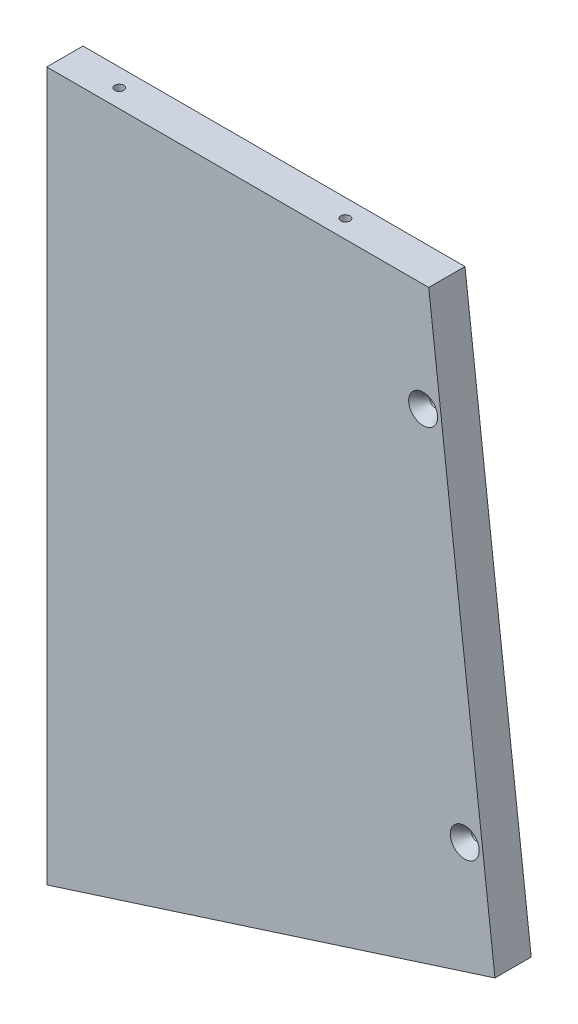
ISO-10303-21;
HEADER;
FILE_DESCRIPTION(('STEP AP214'),'2;1');
FILE_NAME('part.step','',(''),(''),'','','');
FILE_SCHEMA(('AUTOMOTIVE_DESIGN { 1 0 10303 214 1 1 1 1 }'));
ENDSEC;
DATA;
#1=APPLICATION_CONTEXT('core data for automotive mechanical design processes');
#2=APPLICATION_PROTOCOL_DEFINITION('international standard','automotive_design',2000,#1);
#3=PRODUCT_CONTEXT('',#1,'mechanical');
#4=PRODUCT('Part','Part','',(#3));
#5=PRODUCT_RELATED_PRODUCT_CATEGORY('part','',(#4));
#6=PRODUCT_DEFINITION_FORMATION('','',#4);
#7=PRODUCT_DEFINITION_CONTEXT('part definition',#1,'design');
#8=PRODUCT_DEFINITION('design','',#6,#7);
#9=PRODUCT_DEFINITION_SHAPE('','',#8);
#10=(LENGTH_UNIT() NAMED_UNIT(*) SI_UNIT(.MILLI.,.METRE.));
#11=(NAMED_UNIT(*) PLANE_ANGLE_UNIT() SI_UNIT($,.RADIAN.));
#12=(NAMED_UNIT(*) SI_UNIT($,.STERADIAN.) SOLID_ANGLE_UNIT());
#13=UNCERTAINTY_MEASURE_WITH_UNIT(LENGTH_MEASURE(1.E-05),#10,'distance_accuracy_value','');
#14=(GEOMETRIC_REPRESENTATION_CONTEXT(3) GLOBAL_UNCERTAINTY_ASSIGNED_CONTEXT((#13)) GLOBAL_UNIT_ASSIGNED_CONTEXT((#10,
#11,#12)) REPRESENTATION_CONTEXT('',''));
#15=CARTESIAN_POINT('',(0.,0.,0.));
#16=DIRECTION('',(0.,0.,1.));
#17=DIRECTION('',(1.,0.,0.));
#18=AXIS2_PLACEMENT_3D('',#15,#16,#17);
#19=CARTESIAN_POINT('',(-64.9774169834746,-197.96604829264,-12.7));
#20=DIRECTION('',(0.993195579602869,0.11645832154604,0.));
#21=DIRECTION('',(-0.11645832154604,0.993195579602869,0.));
#22=AXIS2_PLACEMENT_3D('',#19,#20,#21);
#23=PLANE('',#22);
#24=DIRECTION('',(-0.11645832154604,0.993195579602869,0.));
#25=VECTOR('',#24,1.);
#26=CARTESIAN_POINT('',(-64.9774169834746,-197.96604829264,0.));
#27=LINE('',#26,#25);
#28=CARTESIAN_POINT('',(-64.9774169834746,-197.96604829264,0.));
#29=VERTEX_POINT('',#28);
#30=CARTESIAN_POINT('',(-88.1901599524693,1.09287578986539E-13,0.));
#31=VERTEX_POINT('',#30);
#32=EDGE_CURVE('E190',#29,#31,#27,.T.);
#33=ORIENTED_EDGE('',*,*,#32,.F.);
#34=DIRECTION('',(0.,0.,1.));
#35=VECTOR('',#34,1.);
#36=CARTESIAN_POINT('',(-64.9774169834746,-197.96604829264,-12.7));
#37=LINE('',#36,#35);
#38=CARTESIAN_POINT('',(-64.9774169834746,-197.96604829264,-12.7));
#39=VERTEX_POINT('',#38);
#40=EDGE_CURVE('E11',#39,#29,#37,.T.);
#41=ORIENTED_EDGE('',*,*,#40,.F.);
#42=DIRECTION('',(-0.11645832154604,0.993195579602869,0.));
#43=VECTOR('',#42,1.);
#44=CARTESIAN_POINT('',(-64.9774169834746,-197.96604829264,-12.7));
#45=LINE('',#44,#43);
#46=CARTESIAN_POINT('',(-88.1901599524693,1.09287578986539E-13,-12.7));
#47=VERTEX_POINT('',#46);
#48=EDGE_CURVE('E177',#39,#47,#45,.T.);
#49=ORIENTED_EDGE('',*,*,#48,.T.);
#50=DIRECTION('',(0.,0.,1.));
#51=VECTOR('',#50,1.);
#52=CARTESIAN_POINT('',(-88.1901599524693,1.09287578986539E-13,-12.7));
#53=LINE('',#52,#51);
#54=EDGE_CURVE('E93',#47,#31,#53,.T.);
#55=ORIENTED_EDGE('',*,*,#54,.T.);
#56=EDGE_LOOP('',(#33,#41,#49,#55));
#57=FACE_BOUND('',#56,.T.);
#58=ADVANCED_FACE('F41',(#57),#23,.T.);
#59=CARTESIAN_POINT('',(-64.9774169834746,-197.96604829264,-12.7));
#60=DIRECTION('',(0.304884492171613,-0.952389335531041,0.));
#61=DIRECTION('',(0.952389335531041,0.304884492171613,0.));
#62=AXIS2_PLACEMENT_3D('',#59,#60,#61);
#63=PLANE('',#62);
#64=CARTESIAN_POINT('',(-104.122442077063,-210.497384639502,-6.35000000000022));
#65=DIRECTION('',(0.304884492171613,-0.952389335531041,0.));
#66=DIRECTION('',(0.952389335531041,0.304884492171613,0.));
#67=AXIS2_PLACEMENT_3D('',#64,#65,#66);
#68=CIRCLE('',#67,1.5875);
#69=CARTESIAN_POINT('',(-102.610524006908,-210.013380508179,-6.35000000000022));
#70=VERTEX_POINT('',#69);
#71=EDGE_CURVE('E44',#70,#70,#68,.T.);
#72=ORIENTED_EDGE('',*,*,#71,.F.);
#73=EDGE_LOOP('',(#72));
#74=FACE_BOUND('',#73,.T.);
#75=CARTESIAN_POINT('',(-197.28641066666,-240.321583832465,-6.35000000000024));
#76=DIRECTION('',(0.304884492171613,-0.952389335531041,0.));
#77=DIRECTION('',(0.952389335531041,0.304884492171613,0.));
#78=AXIS2_PLACEMENT_3D('',#75,#76,#77);
#79=CIRCLE('',#78,1.5875);
#80=CARTESIAN_POINT('',(-195.774492596505,-239.837579701142,-6.35000000000024));
#81=VERTEX_POINT('',#80);
#82=EDGE_CURVE('E138',#81,#81,#79,.T.);
#83=ORIENTED_EDGE('',*,*,#82,.F.);
#84=EDGE_LOOP('',(#83));
#85=FACE_BOUND('',#84,.T.);
#86=DIRECTION('',(0.952389335531041,0.304884492171613,0.));
#87=VECTOR('',#86,1.);
#88=CARTESIAN_POINT('',(-64.9774169834746,-197.96604829264,0.));
#89=LINE('',#88,#87);
#90=CARTESIAN_POINT('',(-222.05296718065,-248.249999999995,0.));
#91=VERTEX_POINT('',#90);
#92=EDGE_CURVE('E181',#91,#29,#89,.T.);
#93=ORIENTED_EDGE('',*,*,#92,.F.);
#94=DIRECTION('',(0.,0.,1.));
#95=VECTOR('',#94,1.);
#96=CARTESIAN_POINT('',(-222.05296718065,-248.249999999995,-12.7));
#97=LINE('',#96,#95);
#98=CARTESIAN_POINT('',(-222.05296718065,-248.249999999995,-12.7));
#99=VERTEX_POINT('',#98);
#100=EDGE_CURVE('E51',#99,#91,#97,.T.);
#101=ORIENTED_EDGE('',*,*,#100,.F.);
#102=DIRECTION('',(0.952389335531041,0.304884492171613,0.));
#103=VECTOR('',#102,1.);
#104=CARTESIAN_POINT('',(-64.9774169834746,-197.96604829264,-12.7));
#105=LINE('',#104,#103);
#106=EDGE_CURVE('E187',#99,#39,#105,.T.);
#107=ORIENTED_EDGE('',*,*,#106,.T.);
#108=ORIENTED_EDGE('',*,*,#40,.T.);
#109=EDGE_LOOP('',(#93,#101,#107,#108));
#110=FACE_BOUND('',#109,.T.);
#111=ADVANCED_FACE('F232',(#74,#85,#110),#63,.T.);
#112=CARTESIAN_POINT('',(-222.05296718065,-248.249999999995,-12.7));
#113=DIRECTION('',(-1.,0.,0.));
#114=DIRECTION('',(0.,-1.,0.));
#115=AXIS2_PLACEMENT_3D('',#112,#113,#114);
#116=PLANE('',#115);
#117=CARTESIAN_POINT('',(-222.05296718065,-210.149999999478,-6.35000000000013));
#118=DIRECTION('',(-1.,0.,0.));
#119=DIRECTION('',(0.,-1.,0.));
#120=AXIS2_PLACEMENT_3D('',#117,#118,#119);
#121=CIRCLE('',#120,1.58749999999999);
#122=CARTESIAN_POINT('',(-222.05296718065,-211.737499999478,-6.35000000000013));
#123=VERTEX_POINT('',#122);
#124=EDGE_CURVE('E171',#123,#123,#121,.T.);
#125=ORIENTED_EDGE('',*,*,#124,.F.);
#126=EDGE_LOOP('',(#125));
#127=FACE_BOUND('',#126,.T.);
#128=CARTESIAN_POINT('',(-222.05296718065,-38.099999999484,-6.35000000000013));
#129=DIRECTION('',(-1.,0.,0.));
#130=DIRECTION('',(0.,-1.,0.));
#131=AXIS2_PLACEMENT_3D('',#128,#129,#130);
#132=CIRCLE('',#131,1.5875);
#133=CARTESIAN_POINT('',(-222.05296718065,-39.687499999484,-6.35000000000013));
#134=VERTEX_POINT('',#133);
#135=EDGE_CURVE('E176',#134,#134,#132,.T.);
#136=ORIENTED_EDGE('',*,*,#135,.F.);
#137=EDGE_LOOP('',(#136));
#138=FACE_BOUND('',#137,.T.);
#139=DIRECTION('',(0.,-1.,0.));
#140=VECTOR('',#139,1.);
#141=CARTESIAN_POINT('',(-222.05296718065,-248.249999999995,0.));
#142=LINE('',#141,#140);
#143=CARTESIAN_POINT('',(-222.05296718065,0.,0.));
#144=VERTEX_POINT('',#143);
#145=EDGE_CURVE('E198',#144,#91,#142,.T.);
#146=ORIENTED_EDGE('',*,*,#145,.F.);
#147=DIRECTION('',(0.,0.,1.));
#148=VECTOR('',#147,1.);
#149=CARTESIAN_POINT('',(-222.05296718065,0.,-12.7));
#150=LINE('',#149,#148);
#151=CARTESIAN_POINT('',(-222.05296718065,0.,-12.7));
#152=VERTEX_POINT('',#151);
#153=EDGE_CURVE('E205',#152,#144,#150,.T.);
#154=ORIENTED_EDGE('',*,*,#153,.F.);
#155=DIRECTION('',(0.,-1.,0.));
#156=VECTOR('',#155,1.);
#157=CARTESIAN_POINT('',(-222.05296718065,-248.249999999995,-12.7));
#158=LINE('',#157,#156);
#159=EDGE_CURVE('E184',#152,#99,#158,.T.);
#160=ORIENTED_EDGE('',*,*,#159,.T.);
#161=ORIENTED_EDGE('',*,*,#100,.T.);
#162=EDGE_LOOP('',(#146,#154,#160,#161));
#163=FACE_BOUND('',#162,.T.);
#164=ADVANCED_FACE('F234',(#127,#138,#163),#116,.T.);
#165=CARTESIAN_POINT('',(-88.1901599524693,1.09287578986539E-13,-12.7));
#166=DIRECTION('',(0.,1.,0.));
#167=DIRECTION('',(-1.,0.,0.));
#168=AXIS2_PLACEMENT_3D('',#165,#166,#167);
#169=PLANE('',#168);
#170=CARTESIAN_POINT('',(-203.002967180656,0.,-6.34999999999997));
#171=DIRECTION('',(0.,1.,0.));
#172=DIRECTION('',(-1.,0.,0.));
#173=AXIS2_PLACEMENT_3D('',#170,#171,#172);
#174=CIRCLE('',#173,1.58749999999999);
#175=CARTESIAN_POINT('',(-204.590467180656,0.,-6.34999999999997));
#176=VERTEX_POINT('',#175);
#177=EDGE_CURVE('E143',#176,#176,#174,.T.);
#178=ORIENTED_EDGE('',*,*,#177,.F.);
#179=EDGE_LOOP('',(#178));
#180=FACE_BOUND('',#179,.T.);
#181=CARTESIAN_POINT('',(-123.747327392623,0.,-6.34999999999999));
#182=DIRECTION('',(0.,1.,0.));
#183=DIRECTION('',(-1.,0.,0.));
#184=AXIS2_PLACEMENT_3D('',#181,#182,#183);
#185=CIRCLE('',#184,1.5875);
#186=CARTESIAN_POINT('',(-125.334827392623,0.,-6.34999999999999));
#187=VERTEX_POINT('',#186);
#188=EDGE_CURVE('E148',#187,#187,#185,.T.);
#189=ORIENTED_EDGE('',*,*,#188,.F.);
#190=EDGE_LOOP('',(#189));
#191=FACE_BOUND('',#190,.T.);
#192=DIRECTION('',(-1.,0.,0.));
#193=VECTOR('',#192,1.);
#194=CARTESIAN_POINT('',(-88.1901599524693,1.09287578986539E-13,0.));
#195=LINE('',#194,#193);
#196=EDGE_CURVE('E194',#31,#144,#195,.T.);
#197=ORIENTED_EDGE('',*,*,#196,.F.);
#198=ORIENTED_EDGE('',*,*,#54,.F.);
#199=DIRECTION('',(-1.,0.,0.));
#200=VECTOR('',#199,1.);
#201=CARTESIAN_POINT('',(-88.1901599524693,1.09287578986539E-13,-12.7));
#202=LINE('',#201,#200);
#203=EDGE_CURVE('E180',#47,#152,#202,.T.);
#204=ORIENTED_EDGE('',*,*,#203,.T.);
#205=ORIENTED_EDGE('',*,*,#153,.T.);
#206=EDGE_LOOP('',(#197,#198,#204,#205));
#207=FACE_BOUND('',#206,.T.);
#208=ADVANCED_FACE('F243',(#180,#191,#207),#169,.T.);
#209=CARTESIAN_POINT('',(0.,0.,-12.7));
#210=DIRECTION('',(0.,0.,1.));
#211=DIRECTION('',(1.,0.,0.));
#212=AXIS2_PLACEMENT_3D('',#209,#210,#211);
#213=PLANE('',#212);
#214=CARTESIAN_POINT('',(-75.5766743950018,-162.097975038468,-12.7));
#215=DIRECTION('',(0.,0.,1.));
#216=DIRECTION('',(1.,0.,0.));
#217=AXIS2_PLACEMENT_3D('',#214,#215,#216);
#218=CIRCLE('',#217,1.5875);
#219=CARTESIAN_POINT('',(-73.9891743950018,-162.097975038468,-12.7));
#220=VERTEX_POINT('',#219);
#221=EDGE_CURVE('E157',#220,#220,#218,.T.);
#222=ORIENTED_EDGE('',*,*,#221,.T.);
#223=EDGE_LOOP('',(#222));
#224=FACE_BOUND('',#223,.T.);
#225=CARTESIAN_POINT('',(-90.1466019911939,-37.8407515823405,-12.7));
#226=DIRECTION('',(0.,0.,1.));
#227=DIRECTION('',(1.,0.,0.));
#228=AXIS2_PLACEMENT_3D('',#225,#226,#227);
#229=CIRCLE('',#228,1.5875);
#230=CARTESIAN_POINT('',(-88.5591019911939,-37.8407515823405,-12.7));
#231=VERTEX_POINT('',#230);
#232=EDGE_CURVE('E166',#231,#231,#229,.T.);
#233=ORIENTED_EDGE('',*,*,#232,.T.);
#234=EDGE_LOOP('',(#233));
#235=FACE_BOUND('',#234,.T.);
#236=ORIENTED_EDGE('',*,*,#48,.F.);
#237=ORIENTED_EDGE('',*,*,#106,.F.);
#238=ORIENTED_EDGE('',*,*,#159,.F.);
#239=ORIENTED_EDGE('',*,*,#203,.F.);
#240=EDGE_LOOP('',(#236,#237,#238,#239));
#241=FACE_BOUND('',#240,.T.);
#242=ADVANCED_FACE('F242',(#224,#235,#241),#213,.F.);
#243=CARTESIAN_POINT('',(0.,0.,0.));
#244=DIRECTION('',(0.,0.,1.));
#245=DIRECTION('',(1.,0.,0.));
#246=AXIS2_PLACEMENT_3D('',#243,#244,#245);
#247=PLANE('',#246);
#248=CARTESIAN_POINT('',(-75.5766743950018,-162.097975038468,3.74873743158588E-12));
#249=DIRECTION('',(0.,0.,1.));
#250=DIRECTION('',(1.,0.,0.));
#251=AXIS2_PLACEMENT_3D('',#248,#249,#250);
#252=CIRCLE('',#251,5.08);
#253=CARTESIAN_POINT('',(-70.4966743950018,-162.097975038468,3.74873743157385E-12));
#254=VERTEX_POINT('',#253);
#255=EDGE_CURVE('E149',#254,#254,#252,.T.);
#256=ORIENTED_EDGE('',*,*,#255,.F.);
#257=EDGE_LOOP('',(#256));
#258=FACE_BOUND('',#257,.T.);
#259=CARTESIAN_POINT('',(-90.1466019911939,-37.8407515823405,3.74873743158588E-12));
#260=DIRECTION('',(0.,0.,1.));
#261=DIRECTION('',(1.,0.,0.));
#262=AXIS2_PLACEMENT_3D('',#259,#260,#261);
#263=CIRCLE('',#262,5.08);
#264=CARTESIAN_POINT('',(-85.0666019911939,-37.8407515823405,3.74873743157385E-12));
#265=VERTEX_POINT('',#264);
#266=EDGE_CURVE('E158',#265,#265,#263,.T.);
#267=ORIENTED_EDGE('',*,*,#266,.F.);
#268=EDGE_LOOP('',(#267));
#269=FACE_BOUND('',#268,.T.);
#270=ORIENTED_EDGE('',*,*,#32,.T.);
#271=ORIENTED_EDGE('',*,*,#196,.T.);
#272=ORIENTED_EDGE('',*,*,#145,.T.);
#273=ORIENTED_EDGE('',*,*,#92,.T.);
#274=EDGE_LOOP('',(#270,#271,#272,#273));
#275=FACE_BOUND('',#274,.T.);
#276=ADVANCED_FACE('F238',(#258,#269,#275),#247,.T.);
#277=CARTESIAN_POINT('',(-203.002967180657,-38.099999999484,-6.35000000000013));
#278=DIRECTION('',(-1.,0.,0.));
#279=DIRECTION('',(0.,0.,1.));
#280=AXIS2_PLACEMENT_3D('',#277,#278,#279);
#281=CONICAL_SURFACE('',#280,1.5875,1.02974425867666);
#282=CARTESIAN_POINT('',(-202.049100947951,-38.099999999484,-6.35000000000013));
#283=VERTEX_POINT('',#282);
#284=VERTEX_LOOP('',#283);
#285=FACE_BOUND('',#284,.T.);
#286=CARTESIAN_POINT('',(-203.002967180657,-38.099999999484,-6.35000000000013));
#287=DIRECTION('',(-1.,0.,0.));
#288=DIRECTION('',(0.,0.,1.));
#289=AXIS2_PLACEMENT_3D('',#286,#287,#288);
#290=CIRCLE('',#289,1.5875);
#291=CARTESIAN_POINT('',(-203.002967180657,-38.099999999484,-4.76250000000013));
#292=VERTEX_POINT('',#291);
#293=EDGE_CURVE('E172',#292,#292,#290,.T.);
#294=ORIENTED_EDGE('',*,*,#293,.T.);
#295=EDGE_LOOP('',(#294));
#296=FACE_BOUND('',#295,.T.);
#297=ADVANCED_FACE('F386',(#285,#296),#281,.F.);
#298=CARTESIAN_POINT('',(-234.752967180657,-38.099999999484,-6.35000000000013));
#299=DIRECTION('',(-1.,0.,0.));
#300=DIRECTION('',(0.,0.,1.));
#301=AXIS2_PLACEMENT_3D('',#298,#299,#300);
#302=CYLINDRICAL_SURFACE('',#301,1.5875);
#303=ORIENTED_EDGE('',*,*,#135,.T.);
#304=EDGE_LOOP('',(#303));
#305=FACE_BOUND('',#304,.T.);
#306=ORIENTED_EDGE('',*,*,#293,.F.);
#307=EDGE_LOOP('',(#306));
#308=FACE_BOUND('',#307,.T.);
#309=ADVANCED_FACE('F382',(#305,#308),#302,.F.);
#310=CARTESIAN_POINT('',(-203.002967180657,-210.149999999478,-6.35000000000013));
#311=DIRECTION('',(-1.,0.,0.));
#312=DIRECTION('',(0.,0.,1.));
#313=AXIS2_PLACEMENT_3D('',#310,#311,#312);
#314=CONICAL_SURFACE('',#313,1.58749999999999,1.02974425867666);
#315=CARTESIAN_POINT('',(-202.049100947951,-210.149999999478,-6.35000000000013));
#316=VERTEX_POINT('',#315);
#317=VERTEX_LOOP('',#316);
#318=FACE_BOUND('',#317,.T.);
#319=CARTESIAN_POINT('',(-203.002967180657,-210.149999999478,-6.35000000000013));
#320=DIRECTION('',(-1.,0.,0.));
#321=DIRECTION('',(0.,0.,1.));
#322=AXIS2_PLACEMENT_3D('',#319,#320,#321);
#323=CIRCLE('',#322,1.58749999999999);
#324=CARTESIAN_POINT('',(-203.002967180657,-210.149999999478,-4.76250000000014));
#325=VERTEX_POINT('',#324);
#326=EDGE_CURVE('E167',#325,#325,#323,.T.);
#327=ORIENTED_EDGE('',*,*,#326,.T.);
#328=EDGE_LOOP('',(#327));
#329=FACE_BOUND('',#328,.T.);
#330=ADVANCED_FACE('F378',(#318,#329),#314,.F.);
#331=CARTESIAN_POINT('',(-234.752967180657,-210.149999999478,-6.35000000000013));
#332=DIRECTION('',(-1.,0.,0.));
#333=DIRECTION('',(0.,0.,1.));
#334=AXIS2_PLACEMENT_3D('',#331,#332,#333);
#335=CYLINDRICAL_SURFACE('',#334,1.58749999999999);
#336=ORIENTED_EDGE('',*,*,#124,.T.);
#337=EDGE_LOOP('',(#336));
#338=FACE_BOUND('',#337,.T.);
#339=ORIENTED_EDGE('',*,*,#326,.F.);
#340=EDGE_LOOP('',(#339));
#341=FACE_BOUND('',#340,.T.);
#342=ADVANCED_FACE('F374',(#338,#341),#335,.F.);
#343=CARTESIAN_POINT('',(-90.1466019911939,-37.8407515823405,3.7470027081099E-12));
#344=DIRECTION('',(0.,0.,1.));
#345=DIRECTION('',(1.,0.,0.));
#346=AXIS2_PLACEMENT_3D('',#343,#344,#345);
#347=CYLINDRICAL_SURFACE('',#346,1.5875);
#348=CARTESIAN_POINT('',(-90.1466019911939,-37.8407515823405,-4.01766166221562));
#349=DIRECTION('',(0.,0.,1.));
#350=DIRECTION('',(1.,0.,0.));
#351=AXIS2_PLACEMENT_3D('',#348,#349,#350);
#352=CIRCLE('',#351,1.58749999999999);
#353=CARTESIAN_POINT('',(-88.5591019911939,-37.8407515823405,-4.01766166221562));
#354=VERTEX_POINT('',#353);
#355=EDGE_CURVE('E162',#354,#354,#352,.T.);
#356=ORIENTED_EDGE('',*,*,#355,.T.);
#357=EDGE_LOOP('',(#356));
#358=FACE_BOUND('',#357,.T.);
#359=ORIENTED_EDGE('',*,*,#232,.F.);
#360=EDGE_LOOP('',(#359));
#361=FACE_BOUND('',#360,.T.);
#362=ADVANCED_FACE('F370',(#358,#361),#347,.F.);
#363=CARTESIAN_POINT('',(-90.1466019911939,-37.8407515823405,3.74873743158588E-12));
#364=DIRECTION('',(0.,0.,1.));
#365=DIRECTION('',(1.,0.,0.));
#366=AXIS2_PLACEMENT_3D('',#363,#364,#365);
#367=CONICAL_SURFACE('',#366,5.08,0.715584993317678);
#368=CARTESIAN_POINT('',(-88.5591019911939,-37.8407515823405,-4.01766166221562));
#369=CARTESIAN_POINT('',(-88.5227217828606,-37.8407515823405,-3.97581101990083));
#370=CARTESIAN_POINT('',(-88.4863415745272,-37.8407515823405,-3.93396037758605));
#371=CARTESIAN_POINT('',(-88.4135811578606,-37.8407515823405,-3.85025909295648));
#372=CARTESIAN_POINT('',(-88.3772009495272,-37.8407515823405,-3.80840845064169));
#373=CARTESIAN_POINT('',(-88.3044405328606,-37.8407515823405,-3.72470716601212));
#374=CARTESIAN_POINT('',(-88.2680603245272,-37.8407515823405,-3.68285652369734));
#375=CARTESIAN_POINT('',(-88.1952999078606,-37.8407515823405,-3.59915523906777));
#376=CARTESIAN_POINT('',(-88.1589196995272,-37.8407515823405,-3.55730459675298));
#377=CARTESIAN_POINT('',(-88.0861592828606,-37.8407515823405,-3.47360331212341));
#378=CARTESIAN_POINT('',(-88.0497790745272,-37.8407515823405,-3.43175266980863));
#379=CARTESIAN_POINT('',(-87.9770186578606,-37.8407515823405,-3.34805138517906));
#380=CARTESIAN_POINT('',(-87.9406384495272,-37.8407515823405,-3.30620074286427));
#381=CARTESIAN_POINT('',(-87.8678780328606,-37.8407515823405,-3.2224994582347));
#382=CARTESIAN_POINT('',(-87.8314978245272,-37.8407515823405,-3.18064881591991));
#383=CARTESIAN_POINT('',(-87.7587374078606,-37.8407515823405,-3.09694753129035));
#384=CARTESIAN_POINT('',(-87.7223571995272,-37.8407515823405,-3.05509688897556));
#385=CARTESIAN_POINT('',(-87.6495967828606,-37.8407515823405,-2.97139560434599));
#386=CARTESIAN_POINT('',(-87.6132165745272,-37.8407515823405,-2.92954496203121));
#387=CARTESIAN_POINT('',(-87.5404561578606,-37.8407515823405,-2.84584367740164));
#388=CARTESIAN_POINT('',(-87.5040759495272,-37.8407515823405,-2.80399303508685));
#389=CARTESIAN_POINT('',(-87.4313155328606,-37.8407515823405,-2.72029175045728));
#390=CARTESIAN_POINT('',(-87.3949353245272,-37.8407515823405,-2.67844110814249));
#391=CARTESIAN_POINT('',(-87.3221749078606,-37.8407515823405,-2.59473982351293));
#392=CARTESIAN_POINT('',(-87.2857946995272,-37.8407515823405,-2.55288918119814));
#393=CARTESIAN_POINT('',(-87.2130342828606,-37.8407515823405,-2.46918789656857));
#394=CARTESIAN_POINT('',(-87.1766540745272,-37.8407515823405,-2.42733725425379));
#395=CARTESIAN_POINT('',(-87.1038936578606,-37.8407515823405,-2.34363596962422));
#396=CARTESIAN_POINT('',(-87.0675134495272,-37.8407515823405,-2.30178532730943));
#397=CARTESIAN_POINT('',(-86.9947530328606,-37.8407515823405,-2.21808404267986));
#398=CARTESIAN_POINT('',(-86.9583728245272,-37.8407515823405,-2.17623340036507));
#399=CARTESIAN_POINT('',(-86.8856124078606,-37.8407515823405,-2.0925321157355));
#400=CARTESIAN_POINT('',(-86.8492321995272,-37.8407515823405,-2.05068147342072));
#401=CARTESIAN_POINT('',(-86.7764717828606,-37.8407515823405,-1.96698018879115));
#402=CARTESIAN_POINT('',(-86.7400915745272,-37.8407515823405,-1.92512954647636));
#403=CARTESIAN_POINT('',(-86.6673311578606,-37.8407515823405,-1.84142826184679));
#404=CARTESIAN_POINT('',(-86.6309509495272,-37.8407515823405,-1.79957761953201));
#405=CARTESIAN_POINT('',(-86.5581905328606,-37.8407515823405,-1.71587633490244));
#406=CARTESIAN_POINT('',(-86.5218103245272,-37.8407515823405,-1.67402569258765));
#407=CARTESIAN_POINT('',(-86.4490499078606,-37.8407515823405,-1.59032440795808));
#408=CARTESIAN_POINT('',(-86.4126696995272,-37.8407515823405,-1.5484737656433));
#409=CARTESIAN_POINT('',(-86.3399092828606,-37.8407515823405,-1.46477248101373));
#410=CARTESIAN_POINT('',(-86.3035290745272,-37.8407515823405,-1.42292183869894));
#411=CARTESIAN_POINT('',(-86.2307686578606,-37.8407515823405,-1.33922055406937));
#412=CARTESIAN_POINT('',(-86.1943884495272,-37.8407515823405,-1.29736991175459));
#413=CARTESIAN_POINT('',(-86.1216280328606,-37.8407515823405,-1.21366862712502));
#414=CARTESIAN_POINT('',(-86.0852478245272,-37.8407515823405,-1.17181798481023));
#415=CARTESIAN_POINT('',(-86.0124874078606,-37.8407515823405,-1.08811670018066));
#416=CARTESIAN_POINT('',(-85.9761071995272,-37.8407515823405,-1.04626605786588));
#417=CARTESIAN_POINT('',(-85.9033467828606,-37.8407515823405,-0.962564773236307));
#418=CARTESIAN_POINT('',(-85.8669665745272,-37.8407515823405,-0.920714130921522));
#419=CARTESIAN_POINT('',(-85.7942061578606,-37.8407515823405,-0.837012846291953));
#420=CARTESIAN_POINT('',(-85.7578259495272,-37.8407515823405,-0.795162203977168));
#421=CARTESIAN_POINT('',(-85.6850655328606,-37.8407515823405,-0.711460919347598));
#422=CARTESIAN_POINT('',(-85.6486853245272,-37.8407515823405,-0.669610277032811));
#423=CARTESIAN_POINT('',(-85.5759249078606,-37.8407515823405,-0.585908992403241));
#424=CARTESIAN_POINT('',(-85.5395446995272,-37.8407515823405,-0.544058350088456));
#425=CARTESIAN_POINT('',(-85.4667842828606,-37.8407515823405,-0.460357065458888));
#426=CARTESIAN_POINT('',(-85.4304040745272,-37.8407515823405,-0.418506423144103));
#427=CARTESIAN_POINT('',(-85.3576436578606,-37.8407515823405,-0.334805138514532));
#428=CARTESIAN_POINT('',(-85.3212634495272,-37.8407515823405,-0.292954496199746));
#429=CARTESIAN_POINT('',(-85.2485030328606,-37.8407515823405,-0.209253211570175));
#430=CARTESIAN_POINT('',(-85.2121228245272,-37.8407515823405,-0.167402569255391));
#431=CARTESIAN_POINT('',(-85.1393624078606,-37.8407515823405,-0.0837012846258222));
#432=CARTESIAN_POINT('',(-85.1029821995272,-37.8407515823405,-0.0418506423110379));
#433=CARTESIAN_POINT('',(-85.0666019911939,-37.8407515823405,3.74873743158588E-12));
#434=B_SPLINE_CURVE_WITH_KNOTS('',3,(#368,#369,#370,#371,#372,#373,#374,#375,#376,#377,#378,
#379,#380,#381,#382,#383,#384,#385,#386,#387,#388,#389,#390,#391,#392,#393,#394,#395,#396,#397,
#398,#399,#400,#401,#402,#403,#404,#405,#406,#407,#408,#409,#410,#411,#412,#413,#414,#415,#416,
#417,#418,#419,#420,#421,#422,#423,#424,#425,#426,#427,#428,#429,#430,#431,#432,#433),
.UNSPECIFIED.,.F.,.F.,(4,2,2,2,2,2,2,2,2,2,2,2,2,2,2,2,2,2,2,2,2,2,2,2,2,2,2,2,2,2,2,2,4),(0.,
0.166357934541254,0.332715869082499,0.499073803623753,0.665431738165007,0.831789672706261,
0.998147607247506,1.16450554178876,1.33086347633001,1.49722141087127,1.66357934541251,
1.82993727995377,1.99629521449502,2.16265314903627,2.32901108357752,2.49536901811877,
2.66172695266003,2.82808488720128,2.99444282174254,3.16080075628378,3.32715869082503,
3.49351662536629,3.65987455990753,3.82623249444879,3.99259042899004,4.15894836353129,
4.32530629807255,4.49166423261379,4.65802216715505,4.8243801016963,4.99073803623755,
5.1570959707788,5.32345390532005),.UNSPECIFIED.);
#435=EDGE_CURVE('BSEAM366',#354,#265,#434,.T.);
#436=ORIENTED_EDGE('',*,*,#355,.F.);
#437=ORIENTED_EDGE('',*,*,#266,.T.);
#438=ORIENTED_EDGE('',*,*,#435,.T.);
#439=ORIENTED_EDGE('',*,*,#435,.F.);
#440=EDGE_LOOP('',(#436,#438,#437,#439));
#441=FACE_BOUND('',#440,.T.);
#442=ADVANCED_FACE('F366',(#441),#367,.F.);
#443=CARTESIAN_POINT('',(-75.5766743950018,-162.097975038468,3.7470027081099E-12));
#444=DIRECTION('',(0.,0.,1.));
#445=DIRECTION('',(1.,0.,0.));
#446=AXIS2_PLACEMENT_3D('',#443,#444,#445);
#447=CYLINDRICAL_SURFACE('',#446,1.5875);
#448=CARTESIAN_POINT('',(-75.5766743950018,-162.097975038468,-4.01766166221562));
#449=DIRECTION('',(0.,0.,1.));
#450=DIRECTION('',(1.,0.,0.));
#451=AXIS2_PLACEMENT_3D('',#448,#449,#450);
#452=CIRCLE('',#451,1.58749999999999);
#453=CARTESIAN_POINT('',(-73.9891743950018,-162.097975038468,-4.01766166221562));
#454=VERTEX_POINT('',#453);
#455=EDGE_CURVE('E153',#454,#454,#452,.T.);
#456=ORIENTED_EDGE('',*,*,#455,.T.);
#457=EDGE_LOOP('',(#456));
#458=FACE_BOUND('',#457,.T.);
#459=ORIENTED_EDGE('',*,*,#221,.F.);
#460=EDGE_LOOP('',(#459));
#461=FACE_BOUND('',#460,.T.);
#462=ADVANCED_FACE('F362',(#458,#461),#447,.F.);
#463=CARTESIAN_POINT('',(-75.5766743950018,-162.097975038468,3.74873743158588E-12));
#464=DIRECTION('',(0.,0.,1.));
#465=DIRECTION('',(1.,0.,0.));
#466=AXIS2_PLACEMENT_3D('',#463,#464,#465);
#467=CONICAL_SURFACE('',#466,5.08,0.715584993317678);
#468=CARTESIAN_POINT('',(-73.9891743950018,-162.097975038468,-4.01766166221562));
#469=CARTESIAN_POINT('',(-73.9527941866685,-162.097975038468,-3.97581101990083));
#470=CARTESIAN_POINT('',(-73.9164139783351,-162.097975038468,-3.93396037758605));
#471=CARTESIAN_POINT('',(-73.8436535616685,-162.097975038468,-3.85025909295648));
#472=CARTESIAN_POINT('',(-73.8072733533352,-162.097975038468,-3.80840845064169));
#473=CARTESIAN_POINT('',(-73.7345129366685,-162.097975038468,-3.72470716601212));
#474=CARTESIAN_POINT('',(-73.6981327283352,-162.097975038468,-3.68285652369734));
#475=CARTESIAN_POINT('',(-73.6253723116685,-162.097975038468,-3.59915523906777));
#476=CARTESIAN_POINT('',(-73.5889921033352,-162.097975038468,-3.55730459675298));
#477=CARTESIAN_POINT('',(-73.5162316866685,-162.097975038468,-3.47360331212341));
#478=CARTESIAN_POINT('',(-73.4798514783352,-162.097975038468,-3.43175266980863));
#479=CARTESIAN_POINT('',(-73.4070910616685,-162.097975038468,-3.34805138517906));
#480=CARTESIAN_POINT('',(-73.3707108533352,-162.097975038468,-3.30620074286427));
#481=CARTESIAN_POINT('',(-73.2979504366685,-162.097975038468,-3.2224994582347));
#482=CARTESIAN_POINT('',(-73.2615702283352,-162.097975038468,-3.18064881591991));
#483=CARTESIAN_POINT('',(-73.1888098116685,-162.097975038468,-3.09694753129035));
#484=CARTESIAN_POINT('',(-73.1524296033352,-162.097975038468,-3.05509688897556));
#485=CARTESIAN_POINT('',(-73.0796691866685,-162.097975038468,-2.97139560434599));
#486=CARTESIAN_POINT('',(-73.0432889783352,-162.097975038468,-2.92954496203121));
#487=CARTESIAN_POINT('',(-72.9705285616685,-162.097975038468,-2.84584367740164));
#488=CARTESIAN_POINT('',(-72.9341483533352,-162.097975038468,-2.80399303508685));
#489=CARTESIAN_POINT('',(-72.8613879366685,-162.097975038468,-2.72029175045728));
#490=CARTESIAN_POINT('',(-72.8250077283352,-162.097975038468,-2.67844110814249));
#491=CARTESIAN_POINT('',(-72.7522473116685,-162.097975038468,-2.59473982351293));
#492=CARTESIAN_POINT('',(-72.7158671033352,-162.097975038468,-2.55288918119814));
#493=CARTESIAN_POINT('',(-72.6431066866685,-162.097975038468,-2.46918789656857));
#494=CARTESIAN_POINT('',(-72.6067264783352,-162.097975038468,-2.42733725425379));
#495=CARTESIAN_POINT('',(-72.5339660616685,-162.097975038468,-2.34363596962422));
#496=CARTESIAN_POINT('',(-72.4975858533352,-162.097975038468,-2.30178532730943));
#497=CARTESIAN_POINT('',(-72.4248254366685,-162.097975038468,-2.21808404267986));
#498=CARTESIAN_POINT('',(-72.3884452283352,-162.097975038468,-2.17623340036507));
#499=CARTESIAN_POINT('',(-72.3156848116685,-162.097975038468,-2.0925321157355));
#500=CARTESIAN_POINT('',(-72.2793046033352,-162.097975038468,-2.05068147342072));
#501=CARTESIAN_POINT('',(-72.2065441866685,-162.097975038468,-1.96698018879115));
#502=CARTESIAN_POINT('',(-72.1701639783352,-162.097975038468,-1.92512954647636));
#503=CARTESIAN_POINT('',(-72.0974035616685,-162.097975038468,-1.84142826184679));
#504=CARTESIAN_POINT('',(-72.0610233533352,-162.097975038468,-1.79957761953201));
#505=CARTESIAN_POINT('',(-71.9882629366685,-162.097975038468,-1.71587633490244));
#506=CARTESIAN_POINT('',(-71.9518827283351,-162.097975038468,-1.67402569258765));
#507=CARTESIAN_POINT('',(-71.8791223116685,-162.097975038468,-1.59032440795808));
#508=CARTESIAN_POINT('',(-71.8427421033352,-162.097975038468,-1.5484737656433));
#509=CARTESIAN_POINT('',(-71.7699816866685,-162.097975038468,-1.46477248101373));
#510=CARTESIAN_POINT('',(-71.7336014783352,-162.097975038468,-1.42292183869894));
#511=CARTESIAN_POINT('',(-71.6608410616685,-162.097975038468,-1.33922055406937));
#512=CARTESIAN_POINT('',(-71.6244608533352,-162.097975038468,-1.29736991175459));
#513=CARTESIAN_POINT('',(-71.5517004366685,-162.097975038468,-1.21366862712502));
#514=CARTESIAN_POINT('',(-71.5153202283352,-162.097975038468,-1.17181798481023));
#515=CARTESIAN_POINT('',(-71.4425598116685,-162.097975038468,-1.08811670018066));
#516=CARTESIAN_POINT('',(-71.4061796033352,-162.097975038468,-1.04626605786588));
#517=CARTESIAN_POINT('',(-71.3334191866685,-162.097975038468,-0.962564773236307));
#518=CARTESIAN_POINT('',(-71.2970389783352,-162.097975038468,-0.920714130921522));
#519=CARTESIAN_POINT('',(-71.2242785616685,-162.097975038468,-0.837012846291953));
#520=CARTESIAN_POINT('',(-71.1878983533352,-162.097975038468,-0.795162203977168));
#521=CARTESIAN_POINT('',(-71.1151379366685,-162.097975038468,-0.711460919347598));
#522=CARTESIAN_POINT('',(-71.0787577283351,-162.097975038468,-0.669610277032811));
#523=CARTESIAN_POINT('',(-71.0059973116685,-162.097975038468,-0.585908992403241));
#524=CARTESIAN_POINT('',(-70.9696171033352,-162.097975038468,-0.544058350088456));
#525=CARTESIAN_POINT('',(-70.8968566866685,-162.097975038468,-0.460357065458888));
#526=CARTESIAN_POINT('',(-70.8604764783352,-162.097975038468,-0.418506423144103));
#527=CARTESIAN_POINT('',(-70.7877160616685,-162.097975038468,-0.334805138514532));
#528=CARTESIAN_POINT('',(-70.7513358533351,-162.097975038468,-0.292954496199746));
#529=CARTESIAN_POINT('',(-70.6785754366685,-162.097975038468,-0.209253211570175));
#530=CARTESIAN_POINT('',(-70.6421952283352,-162.097975038468,-0.167402569255391));
#531=CARTESIAN_POINT('',(-70.5694348116685,-162.097975038468,-0.0837012846258222));
#532=CARTESIAN_POINT('',(-70.5330546033352,-162.097975038468,-0.0418506423110379));
#533=CARTESIAN_POINT('',(-70.4966743950018,-162.097975038468,3.74873743158588E-12));
#534=B_SPLINE_CURVE_WITH_KNOTS('',3,(#468,#469,#470,#471,#472,#473,#474,#475,#476,#477,#478,
#479,#480,#481,#482,#483,#484,#485,#486,#487,#488,#489,#490,#491,#492,#493,#494,#495,#496,#497,
#498,#499,#500,#501,#502,#503,#504,#505,#506,#507,#508,#509,#510,#511,#512,#513,#514,#515,#516,
#517,#518,#519,#520,#521,#522,#523,#524,#525,#526,#527,#528,#529,#530,#531,#532,#533),
.UNSPECIFIED.,.F.,.F.,(4,2,2,2,2,2,2,2,2,2,2,2,2,2,2,2,2,2,2,2,2,2,2,2,2,2,2,2,2,2,2,2,4),(0.,
0.166357934541254,0.332715869082499,0.499073803623753,0.665431738165007,0.831789672706261,
0.998147607247506,1.16450554178876,1.33086347633001,1.49722141087127,1.66357934541251,
1.82993727995377,1.99629521449502,2.16265314903627,2.32901108357752,2.49536901811877,
2.66172695266003,2.82808488720128,2.99444282174254,3.16080075628378,3.32715869082503,
3.49351662536629,3.65987455990753,3.82623249444879,3.99259042899004,4.15894836353129,
4.32530629807255,4.49166423261379,4.65802216715505,4.8243801016963,4.99073803623755,
5.1570959707788,5.32345390532005),.UNSPECIFIED.);
#535=EDGE_CURVE('BSEAM285',#454,#254,#534,.T.);
#536=ORIENTED_EDGE('',*,*,#455,.F.);
#537=ORIENTED_EDGE('',*,*,#255,.T.);
#538=ORIENTED_EDGE('',*,*,#535,.T.);
#539=ORIENTED_EDGE('',*,*,#535,.F.);
#540=EDGE_LOOP('',(#536,#538,#537,#539));
#541=FACE_BOUND('',#540,.T.);
#542=ADVANCED_FACE('F285',(#541),#467,.F.);
#543=CARTESIAN_POINT('',(-123.747327392623,-19.0499999999977,-6.34999999999999));
#544=DIRECTION('',(0.,1.,0.));
#545=DIRECTION('',(0.,0.,1.));
#546=AXIS2_PLACEMENT_3D('',#543,#544,#545);
#547=CONICAL_SURFACE('',#546,1.58750000000001,1.02974425867666);
#548=CARTESIAN_POINT('',(-123.747327392623,-20.003866232704,-6.34999999999999));
#549=VERTEX_POINT('',#548);
#550=VERTEX_LOOP('',#549);
#551=FACE_BOUND('',#550,.T.);
#552=CARTESIAN_POINT('',(-123.747327392623,-19.0499999999977,-6.34999999999999));
#553=DIRECTION('',(0.,1.,0.));
#554=DIRECTION('',(0.,0.,1.));
#555=AXIS2_PLACEMENT_3D('',#552,#553,#554);
#556=CIRCLE('',#555,1.58750000000001);
#557=CARTESIAN_POINT('',(-123.747327392623,-19.0499999999977,-4.76249999999999));
#558=VERTEX_POINT('',#557);
#559=EDGE_CURVE('E144',#558,#558,#556,.T.);
#560=ORIENTED_EDGE('',*,*,#559,.T.);
#561=EDGE_LOOP('',(#560));
#562=FACE_BOUND('',#561,.T.);
#563=ADVANCED_FACE('F290',(#551,#562),#547,.F.);
#564=CARTESIAN_POINT('',(-123.747327392623,12.7000000000023,-6.34999999999999));
#565=DIRECTION('',(0.,1.,0.));
#566=DIRECTION('',(0.,0.,1.));
#567=AXIS2_PLACEMENT_3D('',#564,#565,#566);
#568=CYLINDRICAL_SURFACE('',#567,1.5875);
#569=ORIENTED_EDGE('',*,*,#188,.T.);
#570=EDGE_LOOP('',(#569));
#571=FACE_BOUND('',#570,.T.);
#572=ORIENTED_EDGE('',*,*,#559,.F.);
#573=EDGE_LOOP('',(#572));
#574=FACE_BOUND('',#573,.T.);
#575=ADVANCED_FACE('F295',(#571,#574),#568,.F.);
#576=CARTESIAN_POINT('',(-203.002967180656,-19.0499999999977,-6.34999999999997));
#577=DIRECTION('',(0.,1.,0.));
#578=DIRECTION('',(0.,0.,1.));
#579=AXIS2_PLACEMENT_3D('',#576,#577,#578);
#580=CONICAL_SURFACE('',#579,1.58749999999999,1.02974425867665);
#581=CARTESIAN_POINT('',(-203.002967180656,-20.003866232704,-6.34999999999996));
#582=VERTEX_POINT('',#581);
#583=VERTEX_LOOP('',#582);
#584=FACE_BOUND('',#583,.T.);
#585=CARTESIAN_POINT('',(-203.002967180656,-19.0499999999977,-6.34999999999997));
#586=DIRECTION('',(0.,1.,0.));
#587=DIRECTION('',(0.,0.,1.));
#588=AXIS2_PLACEMENT_3D('',#585,#586,#587);
#589=CIRCLE('',#588,1.58749999999999);
#590=CARTESIAN_POINT('',(-203.002967180656,-19.0499999999977,-4.76249999999997));
#591=VERTEX_POINT('',#590);
#592=EDGE_CURVE('E139',#591,#591,#589,.T.);
#593=ORIENTED_EDGE('',*,*,#592,.T.);
#594=EDGE_LOOP('',(#593));
#595=FACE_BOUND('',#594,.T.);
#596=ADVANCED_FACE('F305',(#584,#595),#580,.F.);
#597=CARTESIAN_POINT('',(-203.002967180656,12.7000000000023,-6.34999999999997));
#598=DIRECTION('',(0.,1.,0.));
#599=DIRECTION('',(0.,0.,1.));
#600=AXIS2_PLACEMENT_3D('',#597,#598,#599);
#601=CYLINDRICAL_SURFACE('',#600,1.58749999999999);
#602=ORIENTED_EDGE('',*,*,#177,.T.);
#603=EDGE_LOOP('',(#602));
#604=FACE_BOUND('',#603,.T.);
#605=ORIENTED_EDGE('',*,*,#592,.F.);
#606=EDGE_LOOP('',(#605));
#607=FACE_BOUND('',#606,.T.);
#608=ADVANCED_FACE('F314',(#604,#607),#601,.F.);
#609=CARTESIAN_POINT('',(-203.094460242519,-222.17856699063,-6.35000000000024));
#610=DIRECTION('',(0.304884492171613,-0.952389335531041,0.));
#611=DIRECTION('',(0.952389335531041,0.304884492171613,0.));
#612=AXIS2_PLACEMENT_3D('',#609,#610,#611);
#613=CONICAL_SURFACE('',#612,1.5875,1.02974425867666);
#614=CARTESIAN_POINT('',(-203.385279264478,-221.270114963078,-6.35000000000024));
#615=VERTEX_POINT('',#614);
#616=VERTEX_LOOP('',#615);
#617=FACE_BOUND('',#616,.T.);
#618=CARTESIAN_POINT('',(-203.094460242519,-222.17856699063,-6.35000000000024));
#619=DIRECTION('',(0.304884492171613,-0.952389335531041,0.));
#620=DIRECTION('',(0.952389335531041,0.304884492171613,0.));
#621=AXIS2_PLACEMENT_3D('',#618,#619,#620);
#622=CIRCLE('',#621,1.5875);
#623=CARTESIAN_POINT('',(-201.582542172364,-221.694562859308,-6.35000000000024));
#624=VERTEX_POINT('',#623);
#625=EDGE_CURVE('E134',#624,#624,#622,.T.);
#626=ORIENTED_EDGE('',*,*,#625,.T.);
#627=EDGE_LOOP('',(#626));
#628=FACE_BOUND('',#627,.T.);
#629=ADVANCED_FACE('F323',(#617,#628),#613,.F.);
#630=CARTESIAN_POINT('',(-193.414377616071,-252.416928393741,-6.35000000000024));
#631=DIRECTION('',(0.304884492171613,-0.952389335531041,0.));
#632=DIRECTION('',(0.952389335531041,0.304884492171613,0.));
#633=AXIS2_PLACEMENT_3D('',#630,#631,#632);
#634=CYLINDRICAL_SURFACE('',#633,1.5875);
#635=ORIENTED_EDGE('',*,*,#82,.T.);
#636=EDGE_LOOP('',(#635));
#637=FACE_BOUND('',#636,.T.);
#638=ORIENTED_EDGE('',*,*,#625,.F.);
#639=EDGE_LOOP('',(#638));
#640=FACE_BOUND('',#639,.T.);
#641=ADVANCED_FACE('F123',(#637,#640),#634,.F.);
#642=CARTESIAN_POINT('',(-109.930491652922,-192.354367797667,-6.35000000000022));
#643=DIRECTION('',(0.304884492171613,-0.952389335531041,0.));
#644=DIRECTION('',(0.952389335531041,0.304884492171613,0.));
#645=AXIS2_PLACEMENT_3D('',#642,#643,#644);
#646=CONICAL_SURFACE('',#645,1.5875,1.02974425867665);
#647=CARTESIAN_POINT('',(-110.22131067488,-191.445915770115,-6.35000000000022));
#648=VERTEX_POINT('',#647);
#649=VERTEX_LOOP('',#648);
#650=FACE_BOUND('',#649,.T.);
#651=CARTESIAN_POINT('',(-109.930491652922,-192.354367797667,-6.35000000000022));
#652=DIRECTION('',(0.304884492171613,-0.952389335531041,0.));
#653=DIRECTION('',(0.952389335531041,0.304884492171613,0.));
#654=AXIS2_PLACEMENT_3D('',#651,#652,#653);
#655=CIRCLE('',#654,1.5875);
#656=CARTESIAN_POINT('',(-108.418573582766,-191.870363666345,-6.35000000000022));
#657=VERTEX_POINT('',#656);
#658=EDGE_CURVE('E127',#657,#657,#655,.T.);
#659=ORIENTED_EDGE('',*,*,#658,.T.);
#660=EDGE_LOOP('',(#659));
#661=FACE_BOUND('',#660,.T.);
#662=ADVANCED_FACE('F119',(#650,#661),#646,.F.);
#663=CARTESIAN_POINT('',(-100.250409026473,-222.592729200778,-6.35000000000022));
#664=DIRECTION('',(0.304884492171613,-0.952389335531041,0.));
#665=DIRECTION('',(0.952389335531041,0.304884492171613,0.));
#666=AXIS2_PLACEMENT_3D('',#663,#664,#665);
#667=CYLINDRICAL_SURFACE('',#666,1.5875);
#668=ORIENTED_EDGE('',*,*,#71,.T.);
#669=EDGE_LOOP('',(#668));
#670=FACE_BOUND('',#669,.T.);
#671=ORIENTED_EDGE('',*,*,#658,.F.);
#672=EDGE_LOOP('',(#671));
#673=FACE_BOUND('',#672,.T.);
#674=ADVANCED_FACE('F122',(#670,#673),#667,.F.);
#675=CLOSED_SHELL('',(#58,#111,#164,#208,#242,#276,#297,#309,#330,#342,#362,#442,#462,#542,#563,
#575,#596,#608,#629,#641,#662,#674));
#676=MANIFOLD_SOLID_BREP('B2',#675);
#677=ADVANCED_BREP_SHAPE_REPRESENTATION('',(#18,#676),#14);
#678=SHAPE_DEFINITION_REPRESENTATION(#9,#677);
ENDSEC;
END-ISO-10303-21;
